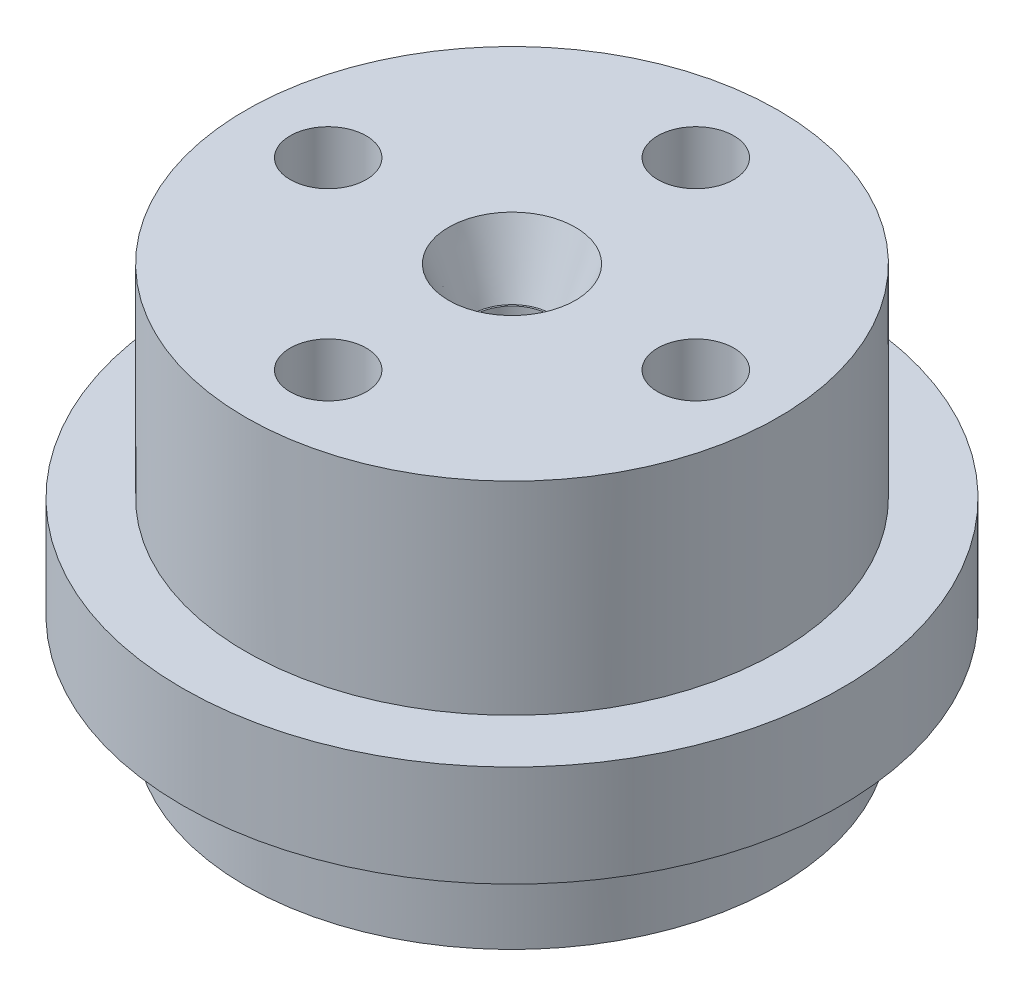
ISO-10303-21;
HEADER;
FILE_DESCRIPTION(('STEP AP214'),'2;1');
FILE_NAME('part.step','',(''),(''),'','','');
FILE_SCHEMA(('AUTOMOTIVE_DESIGN { 1 0 10303 214 1 1 1 1 }'));
ENDSEC;
DATA;
#1=APPLICATION_CONTEXT('core data for automotive mechanical design processes');
#2=APPLICATION_PROTOCOL_DEFINITION('international standard','automotive_design',2000,#1);
#3=PRODUCT_CONTEXT('',#1,'mechanical');
#4=PRODUCT('Part','Part','',(#3));
#5=PRODUCT_RELATED_PRODUCT_CATEGORY('part','',(#4));
#6=PRODUCT_DEFINITION_FORMATION('','',#4);
#7=PRODUCT_DEFINITION_CONTEXT('part definition',#1,'design');
#8=PRODUCT_DEFINITION('design','',#6,#7);
#9=PRODUCT_DEFINITION_SHAPE('','',#8);
#10=(LENGTH_UNIT() NAMED_UNIT(*) SI_UNIT(.MILLI.,.METRE.));
#11=(NAMED_UNIT(*) PLANE_ANGLE_UNIT() SI_UNIT($,.RADIAN.));
#12=(NAMED_UNIT(*) SI_UNIT($,.STERADIAN.) SOLID_ANGLE_UNIT());
#13=UNCERTAINTY_MEASURE_WITH_UNIT(LENGTH_MEASURE(1.E-05),#10,'distance_accuracy_value','');
#14=(GEOMETRIC_REPRESENTATION_CONTEXT(3) GLOBAL_UNCERTAINTY_ASSIGNED_CONTEXT((#13)) GLOBAL_UNIT_ASSIGNED_CONTEXT((#10,
#11,#12)) REPRESENTATION_CONTEXT('',''));
#15=CARTESIAN_POINT('',(0.,0.,0.));
#16=DIRECTION('',(0.,0.,1.));
#17=DIRECTION('',(1.,0.,0.));
#18=AXIS2_PLACEMENT_3D('',#15,#16,#17);
#19=CARTESIAN_POINT('',(0.,16.,0.));
#20=DIRECTION('',(0.,-1.,0.));
#21=DIRECTION('',(0.,0.,-1.));
#22=AXIS2_PLACEMENT_3D('',#19,#20,#21);
#23=CYLINDRICAL_SURFACE('',#22,10.5);
#24=CARTESIAN_POINT('',(0.,16.,0.));
#25=DIRECTION('',(0.,1.,0.));
#26=DIRECTION('',(0.,0.,1.));
#27=AXIS2_PLACEMENT_3D('',#24,#25,#26);
#28=CIRCLE('',#27,10.5);
#29=CARTESIAN_POINT('',(0.,16.,10.5));
#30=VERTEX_POINT('',#29);
#31=EDGE_CURVE('E42',#30,#30,#28,.T.);
#32=ORIENTED_EDGE('',*,*,#31,.F.);
#33=EDGE_LOOP('',(#32));
#34=FACE_BOUND('',#33,.T.);
#35=CARTESIAN_POINT('',(0.,8.,0.));
#36=DIRECTION('',(0.,-1.,0.));
#37=DIRECTION('',(0.,0.,-1.));
#38=AXIS2_PLACEMENT_3D('',#35,#36,#37);
#39=CIRCLE('',#38,10.5);
#40=CARTESIAN_POINT('',(0.,8.,-10.5));
#41=VERTEX_POINT('',#40);
#42=EDGE_CURVE('E10',#41,#41,#39,.T.);
#43=ORIENTED_EDGE('',*,*,#42,.F.);
#44=EDGE_LOOP('',(#43));
#45=FACE_BOUND('',#44,.T.);
#46=ADVANCED_FACE('F35',(#34,#45),#23,.T.);
#47=CARTESIAN_POINT('',(0.,16.,0.));
#48=DIRECTION('',(0.,1.,0.));
#49=DIRECTION('',(0.,0.,1.));
#50=AXIS2_PLACEMENT_3D('',#47,#48,#49);
#51=PLANE('',#50);
#52=CARTESIAN_POINT('',(-7.25000000000016,16.,-3.04711340169281E-13));
#53=DIRECTION('',(0.,1.,0.));
#54=DIRECTION('',(0.,0.,1.));
#55=AXIS2_PLACEMENT_3D('',#52,#53,#54);
#56=CIRCLE('',#55,1.49999999999743);
#57=CARTESIAN_POINT('',(-7.25000000000016,16.,1.49999999999712));
#58=VERTEX_POINT('',#57);
#59=EDGE_CURVE('E137',#58,#58,#56,.T.);
#60=ORIENTED_EDGE('',*,*,#59,.F.);
#61=EDGE_LOOP('',(#60));
#62=FACE_BOUND('',#61,.T.);
#63=CARTESIAN_POINT('',(-1.21608193965515E-13,16.,7.25000000000035));
#64=DIRECTION('',(0.,1.,0.));
#65=DIRECTION('',(0.,0.,1.));
#66=AXIS2_PLACEMENT_3D('',#63,#64,#65);
#67=CIRCLE('',#66,1.49999999999448);
#68=CARTESIAN_POINT('',(-1.21608193965515E-13,16.,8.74999999999483));
#69=VERTEX_POINT('',#68);
#70=EDGE_CURVE('E150',#69,#69,#67,.T.);
#71=ORIENTED_EDGE('',*,*,#70,.F.);
#72=EDGE_LOOP('',(#71));
#73=FACE_BOUND('',#72,.T.);
#74=CARTESIAN_POINT('',(7.25000000000053,16.,3.05599209098663E-13));
#75=DIRECTION('',(0.,1.,0.));
#76=DIRECTION('',(0.,0.,1.));
#77=AXIS2_PLACEMENT_3D('',#74,#75,#76);
#78=CIRCLE('',#77,1.50000000000257);
#79=CARTESIAN_POINT('',(7.25000000000053,16.,1.50000000000288));
#80=VERTEX_POINT('',#79);
#81=EDGE_CURVE('E155',#80,#80,#78,.T.);
#82=ORIENTED_EDGE('',*,*,#81,.F.);
#83=EDGE_LOOP('',(#82));
#84=FACE_BOUND('',#83,.T.);
#85=CARTESIAN_POINT('',(4.89590224231812E-13,16.,-7.25000000000035));
#86=DIRECTION('',(0.,1.,0.));
#87=DIRECTION('',(0.,0.,1.));
#88=AXIS2_PLACEMENT_3D('',#85,#86,#87);
#89=CIRCLE('',#88,1.50000000000552);
#90=CARTESIAN_POINT('',(4.89590224231812E-13,16.,-5.74999999999483));
#91=VERTEX_POINT('',#90);
#92=EDGE_CURVE('E161',#91,#91,#89,.T.);
#93=ORIENTED_EDGE('',*,*,#92,.F.);
#94=EDGE_LOOP('',(#93));
#95=FACE_BOUND('',#94,.T.);
#96=CARTESIAN_POINT('',(0.,16.,0.));
#97=DIRECTION('',(0.,1.,0.));
#98=DIRECTION('',(0.,0.,1.));
#99=AXIS2_PLACEMENT_3D('',#96,#97,#98);
#100=CIRCLE('',#99,2.5);
#101=CARTESIAN_POINT('',(0.,16.,2.5));
#102=VERTEX_POINT('',#101);
#103=EDGE_CURVE('E61',#102,#102,#100,.T.);
#104=ORIENTED_EDGE('',*,*,#103,.F.);
#105=EDGE_LOOP('',(#104));
#106=FACE_BOUND('',#105,.T.);
#107=ORIENTED_EDGE('',*,*,#31,.T.);
#108=EDGE_LOOP('',(#107));
#109=FACE_BOUND('',#108,.T.);
#110=ADVANCED_FACE('F89',(#62,#73,#84,#95,#106,#109),#51,.T.);
#111=CARTESIAN_POINT('',(0.,13.5,0.));
#112=DIRECTION('',(0.,1.,0.));
#113=DIRECTION('',(0.,0.,1.));
#114=AXIS2_PLACEMENT_3D('',#111,#112,#113);
#115=PLANE('',#114);
#116=CARTESIAN_POINT('',(0.,13.5,0.));
#117=DIRECTION('',(0.,1.,0.));
#118=DIRECTION('',(0.,0.,1.));
#119=AXIS2_PLACEMENT_3D('',#116,#117,#118);
#120=CIRCLE('',#119,1.56528830128799);
#121=CARTESIAN_POINT('',(0.,13.5,1.56528830128799));
#122=VERTEX_POINT('',#121);
#123=EDGE_CURVE('E58',#122,#122,#120,.T.);
#124=ORIENTED_EDGE('',*,*,#123,.T.);
#125=EDGE_LOOP('',(#124));
#126=FACE_BOUND('',#125,.T.);
#127=CARTESIAN_POINT('',(0.,13.5,0.));
#128=DIRECTION('',(0.,1.,0.));
#129=DIRECTION('',(0.,0.,1.));
#130=AXIS2_PLACEMENT_3D('',#127,#128,#129);
#131=CIRCLE('',#130,1.5);
#132=CARTESIAN_POINT('',(0.,13.5,1.5));
#133=VERTEX_POINT('',#132);
#134=EDGE_CURVE('E56',#133,#133,#131,.F.);
#135=ORIENTED_EDGE('',*,*,#134,.T.);
#136=EDGE_LOOP('',(#135));
#137=FACE_BOUND('',#136,.T.);
#138=ADVANCED_FACE('F79',(#126,#137),#115,.T.);
#139=CARTESIAN_POINT('',(0.,16.,0.));
#140=DIRECTION('',(0.,1.,0.));
#141=DIRECTION('',(0.,0.,1.));
#142=AXIS2_PLACEMENT_3D('',#139,#140,#141);
#143=CONICAL_SURFACE('',#142,2.5,0.357792496658838);
#144=ORIENTED_EDGE('',*,*,#123,.F.);
#145=EDGE_LOOP('',(#144));
#146=FACE_BOUND('',#145,.T.);
#147=ORIENTED_EDGE('',*,*,#103,.T.);
#148=EDGE_LOOP('',(#147));
#149=FACE_BOUND('',#148,.T.);
#150=ADVANCED_FACE('F82',(#146,#149),#143,.F.);
#151=CARTESIAN_POINT('',(0.,8.,0.));
#152=DIRECTION('',(0.,-1.,0.));
#153=DIRECTION('',(0.,0.,-1.));
#154=AXIS2_PLACEMENT_3D('',#151,#152,#153);
#155=CYLINDRICAL_SURFACE('',#154,13.);
#156=CARTESIAN_POINT('',(0.,8.,0.));
#157=DIRECTION('',(0.,-1.,0.));
#158=DIRECTION('',(0.,0.,-1.));
#159=AXIS2_PLACEMENT_3D('',#156,#157,#158);
#160=CIRCLE('',#159,13.);
#161=CARTESIAN_POINT('',(0.,8.,-13.));
#162=VERTEX_POINT('',#161);
#163=EDGE_CURVE('E62',#162,#162,#160,.T.);
#164=ORIENTED_EDGE('',*,*,#163,.T.);
#165=EDGE_LOOP('',(#164));
#166=FACE_BOUND('',#165,.T.);
#167=CARTESIAN_POINT('',(0.,4.,0.));
#168=DIRECTION('',(0.,-1.,0.));
#169=DIRECTION('',(0.,0.,-1.));
#170=AXIS2_PLACEMENT_3D('',#167,#168,#169);
#171=CIRCLE('',#170,13.);
#172=CARTESIAN_POINT('',(0.,4.,-13.));
#173=VERTEX_POINT('',#172);
#174=EDGE_CURVE('E68',#173,#173,#171,.T.);
#175=ORIENTED_EDGE('',*,*,#174,.F.);
#176=EDGE_LOOP('',(#175));
#177=FACE_BOUND('',#176,.T.);
#178=ADVANCED_FACE('F85',(#166,#177),#155,.T.);
#179=CARTESIAN_POINT('',(0.,4.,0.));
#180=DIRECTION('',(0.,-1.,0.));
#181=DIRECTION('',(0.,0.,-1.));
#182=AXIS2_PLACEMENT_3D('',#179,#180,#181);
#183=PLANE('',#182);
#184=ORIENTED_EDGE('',*,*,#174,.T.);
#185=EDGE_LOOP('',(#184));
#186=FACE_BOUND('',#185,.T.);
#187=CARTESIAN_POINT('',(0.,4.,0.));
#188=DIRECTION('',(0.,-1.,0.));
#189=DIRECTION('',(0.,0.,-1.));
#190=AXIS2_PLACEMENT_3D('',#187,#188,#189);
#191=CIRCLE('',#190,10.5);
#192=CARTESIAN_POINT('',(0.,4.,-10.5));
#193=VERTEX_POINT('',#192);
#194=EDGE_CURVE('E59',#193,#193,#191,.T.);
#195=ORIENTED_EDGE('',*,*,#194,.F.);
#196=EDGE_LOOP('',(#195));
#197=FACE_BOUND('',#196,.T.);
#198=ADVANCED_FACE('F182',(#186,#197),#183,.T.);
#199=CARTESIAN_POINT('',(0.,8.,0.));
#200=DIRECTION('',(0.,-1.,0.));
#201=DIRECTION('',(0.,0.,-1.));
#202=AXIS2_PLACEMENT_3D('',#199,#200,#201);
#203=PLANE('',#202);
#204=ORIENTED_EDGE('',*,*,#163,.F.);
#205=EDGE_LOOP('',(#204));
#206=FACE_BOUND('',#205,.T.);
#207=ORIENTED_EDGE('',*,*,#42,.T.);
#208=EDGE_LOOP('',(#207));
#209=FACE_BOUND('',#208,.T.);
#210=ADVANCED_FACE('F111',(#206,#209),#203,.F.);
#211=CARTESIAN_POINT('',(0.,0.,0.));
#212=DIRECTION('',(0.,1.,0.));
#213=DIRECTION('',(0.,0.,1.));
#214=AXIS2_PLACEMENT_3D('',#211,#212,#213);
#215=CYLINDRICAL_SURFACE('',#214,1.5);
#216=CARTESIAN_POINT('',(0.,0.,0.));
#217=DIRECTION('',(0.,1.,0.));
#218=DIRECTION('',(0.,0.,1.));
#219=AXIS2_PLACEMENT_3D('',#216,#217,#218);
#220=CIRCLE('',#219,1.5);
#221=CARTESIAN_POINT('',(0.,0.,1.5));
#222=VERTEX_POINT('',#221);
#223=EDGE_CURVE('E51',#222,#222,#220,.T.);
#224=ORIENTED_EDGE('',*,*,#223,.F.);
#225=EDGE_LOOP('',(#224));
#226=FACE_BOUND('',#225,.T.);
#227=ORIENTED_EDGE('',*,*,#134,.F.);
#228=EDGE_LOOP('',(#227));
#229=FACE_BOUND('',#228,.T.);
#230=ADVANCED_FACE('F102',(#226,#229),#215,.F.);
#231=CARTESIAN_POINT('',(0.,0.,0.));
#232=DIRECTION('',(0.,1.,0.));
#233=DIRECTION('',(0.,0.,1.));
#234=AXIS2_PLACEMENT_3D('',#231,#232,#233);
#235=PLANE('',#234);
#236=CARTESIAN_POINT('',(0.,0.,7.24999999999996));
#237=DIRECTION('',(0.,1.,0.));
#238=DIRECTION('',(0.,0.,1.));
#239=AXIS2_PLACEMENT_3D('',#236,#237,#238);
#240=CIRCLE('',#239,0.999999999997313);
#241=CARTESIAN_POINT('',(0.,0.,8.24999999999727));
#242=VERTEX_POINT('',#241);
#243=EDGE_CURVE('E116',#242,#242,#240,.T.);
#244=ORIENTED_EDGE('',*,*,#243,.T.);
#245=EDGE_LOOP('',(#244));
#246=FACE_BOUND('',#245,.T.);
#247=CARTESIAN_POINT('',(7.25000000000016,0.,-1.10478750476657E-13));
#248=DIRECTION('',(0.,1.,0.));
#249=DIRECTION('',(0.,0.,1.));
#250=AXIS2_PLACEMENT_3D('',#247,#248,#249);
#251=CIRCLE('',#250,0.999999999997564);
#252=CARTESIAN_POINT('',(7.25000000000016,0.,0.999999999997454));
#253=VERTEX_POINT('',#252);
#254=EDGE_CURVE('E120',#253,#253,#251,.T.);
#255=ORIENTED_EDGE('',*,*,#254,.T.);
#256=EDGE_LOOP('',(#255));
#257=FACE_BOUND('',#256,.T.);
#258=CARTESIAN_POINT('',(0.,0.,-7.25000000000037));
#259=DIRECTION('',(0.,1.,0.));
#260=DIRECTION('',(0.,0.,1.));
#261=AXIS2_PLACEMENT_3D('',#258,#259,#260);
#262=CIRCLE('',#261,0.999999999997694);
#263=CARTESIAN_POINT('',(0.,0.,-6.25000000000268));
#264=VERTEX_POINT('',#263);
#265=EDGE_CURVE('E124',#264,#264,#262,.T.);
#266=ORIENTED_EDGE('',*,*,#265,.T.);
#267=EDGE_LOOP('',(#266));
#268=FACE_BOUND('',#267,.T.);
#269=CARTESIAN_POINT('',(-7.25000000000016,0.,-3.04711340169281E-13));
#270=DIRECTION('',(0.,1.,0.));
#271=DIRECTION('',(0.,0.,1.));
#272=AXIS2_PLACEMENT_3D('',#269,#270,#271);
#273=CIRCLE('',#272,0.999999999997428);
#274=CARTESIAN_POINT('',(-7.25000000000016,0.,0.999999999997124));
#275=VERTEX_POINT('',#274);
#276=EDGE_CURVE('E128',#275,#275,#273,.T.);
#277=ORIENTED_EDGE('',*,*,#276,.T.);
#278=EDGE_LOOP('',(#277));
#279=FACE_BOUND('',#278,.T.);
#280=ORIENTED_EDGE('',*,*,#223,.T.);
#281=EDGE_LOOP('',(#280));
#282=FACE_BOUND('',#281,.T.);
#283=CARTESIAN_POINT('',(0.,0.,0.));
#284=DIRECTION('',(0.,1.,0.));
#285=DIRECTION('',(0.,0.,1.));
#286=AXIS2_PLACEMENT_3D('',#283,#284,#285);
#287=CIRCLE('',#286,10.5);
#288=CARTESIAN_POINT('',(0.,0.,10.5));
#289=VERTEX_POINT('',#288);
#290=EDGE_CURVE('E46',#289,#289,#287,.T.);
#291=ORIENTED_EDGE('',*,*,#290,.F.);
#292=EDGE_LOOP('',(#291));
#293=FACE_BOUND('',#292,.T.);
#294=ADVANCED_FACE('F103',(#246,#257,#268,#279,#282,#293),#235,.F.);
#295=ORIENTED_EDGE('',*,*,#194,.T.);
#296=EDGE_LOOP('',(#295));
#297=FACE_BOUND('',#296,.T.);
#298=ORIENTED_EDGE('',*,*,#290,.T.);
#299=EDGE_LOOP('',(#298));
#300=FACE_BOUND('',#299,.T.);
#301=ADVANCED_FACE('F37',(#297,#300),#23,.T.);
#302=CARTESIAN_POINT('',(4.89590224231812E-13,6.,-7.25000000000035));
#303=DIRECTION('',(0.,1.,0.));
#304=DIRECTION('',(0.,0.,1.));
#305=AXIS2_PLACEMENT_3D('',#302,#303,#304);
#306=CYLINDRICAL_SURFACE('',#305,1.50000000000552);
#307=CARTESIAN_POINT('',(4.89590224231812E-13,6.,-7.25000000000035));
#308=DIRECTION('',(0.,1.,0.));
#309=DIRECTION('',(0.,0.,1.));
#310=AXIS2_PLACEMENT_3D('',#307,#308,#309);
#311=CIRCLE('',#310,1.50000000000552);
#312=CARTESIAN_POINT('',(4.89590224231812E-13,6.,-5.74999999999483));
#313=VERTEX_POINT('',#312);
#314=EDGE_CURVE('E73',#313,#313,#311,.T.);
#315=ORIENTED_EDGE('',*,*,#314,.F.);
#316=EDGE_LOOP('',(#315));
#317=FACE_BOUND('',#316,.T.);
#318=ORIENTED_EDGE('',*,*,#92,.T.);
#319=EDGE_LOOP('',(#318));
#320=FACE_BOUND('',#319,.T.);
#321=ADVANCED_FACE('F110',(#317,#320),#306,.F.);
#322=CARTESIAN_POINT('',(4.89590224231812E-13,6.,-7.25000000000035));
#323=DIRECTION('',(0.,1.,0.));
#324=DIRECTION('',(0.,0.,1.));
#325=AXIS2_PLACEMENT_3D('',#322,#323,#324);
#326=PLANE('',#325);
#327=CARTESIAN_POINT('',(0.,6.,-7.25000000000037));
#328=DIRECTION('',(0.,1.,0.));
#329=DIRECTION('',(0.,0.,1.));
#330=AXIS2_PLACEMENT_3D('',#327,#328,#329);
#331=CIRCLE('',#330,0.999999999997694);
#332=CARTESIAN_POINT('',(0.,6.,-6.25000000000268));
#333=VERTEX_POINT('',#332);
#334=EDGE_CURVE('E146',#333,#333,#331,.T.);
#335=ORIENTED_EDGE('',*,*,#334,.F.);
#336=EDGE_LOOP('',(#335));
#337=FACE_BOUND('',#336,.T.);
#338=ORIENTED_EDGE('',*,*,#314,.T.);
#339=EDGE_LOOP('',(#338));
#340=FACE_BOUND('',#339,.T.);
#341=ADVANCED_FACE('F170',(#337,#340),#326,.T.);
#342=CARTESIAN_POINT('',(7.25000000000053,6.,3.05599209098663E-13));
#343=DIRECTION('',(0.,1.,0.));
#344=DIRECTION('',(0.,0.,1.));
#345=AXIS2_PLACEMENT_3D('',#342,#343,#344);
#346=CYLINDRICAL_SURFACE('',#345,1.50000000000257);
#347=CARTESIAN_POINT('',(7.25000000000053,6.,3.05599209098663E-13));
#348=DIRECTION('',(0.,1.,0.));
#349=DIRECTION('',(0.,0.,1.));
#350=AXIS2_PLACEMENT_3D('',#347,#348,#349);
#351=CIRCLE('',#350,1.50000000000257);
#352=CARTESIAN_POINT('',(7.25000000000053,6.,1.50000000000288));
#353=VERTEX_POINT('',#352);
#354=EDGE_CURVE('E158',#353,#353,#351,.T.);
#355=ORIENTED_EDGE('',*,*,#354,.F.);
#356=EDGE_LOOP('',(#355));
#357=FACE_BOUND('',#356,.T.);
#358=ORIENTED_EDGE('',*,*,#81,.T.);
#359=EDGE_LOOP('',(#358));
#360=FACE_BOUND('',#359,.T.);
#361=ADVANCED_FACE('F176',(#357,#360),#346,.F.);
#362=CARTESIAN_POINT('',(7.25000000000053,6.,3.05599209098663E-13));
#363=DIRECTION('',(0.,1.,0.));
#364=DIRECTION('',(0.,0.,1.));
#365=AXIS2_PLACEMENT_3D('',#362,#363,#364);
#366=PLANE('',#365);
#367=CARTESIAN_POINT('',(7.25000000000016,6.,-1.10478750476657E-13));
#368=DIRECTION('',(0.,1.,0.));
#369=DIRECTION('',(0.,0.,1.));
#370=AXIS2_PLACEMENT_3D('',#367,#368,#369);
#371=CIRCLE('',#370,0.999999999997564);
#372=CARTESIAN_POINT('',(7.25000000000016,6.,0.999999999997454));
#373=VERTEX_POINT('',#372);
#374=EDGE_CURVE('E385',#373,#373,#371,.T.);
#375=ORIENTED_EDGE('',*,*,#374,.F.);
#376=EDGE_LOOP('',(#375));
#377=FACE_BOUND('',#376,.T.);
#378=ORIENTED_EDGE('',*,*,#354,.T.);
#379=EDGE_LOOP('',(#378));
#380=FACE_BOUND('',#379,.T.);
#381=ADVANCED_FACE('F287',(#377,#380),#366,.T.);
#382=CARTESIAN_POINT('',(-1.21608193965515E-13,6.,7.25000000000035));
#383=DIRECTION('',(0.,1.,0.));
#384=DIRECTION('',(0.,0.,1.));
#385=AXIS2_PLACEMENT_3D('',#382,#383,#384);
#386=CYLINDRICAL_SURFACE('',#385,1.49999999999448);
#387=CARTESIAN_POINT('',(-1.21608193965515E-13,6.,7.25000000000035));
#388=DIRECTION('',(0.,1.,0.));
#389=DIRECTION('',(0.,0.,1.));
#390=AXIS2_PLACEMENT_3D('',#387,#388,#389);
#391=CIRCLE('',#390,1.49999999999448);
#392=CARTESIAN_POINT('',(-1.21608193965515E-13,6.,8.74999999999483));
#393=VERTEX_POINT('',#392);
#394=EDGE_CURVE('E152',#393,#393,#391,.T.);
#395=ORIENTED_EDGE('',*,*,#394,.F.);
#396=EDGE_LOOP('',(#395));
#397=FACE_BOUND('',#396,.T.);
#398=ORIENTED_EDGE('',*,*,#70,.T.);
#399=EDGE_LOOP('',(#398));
#400=FACE_BOUND('',#399,.T.);
#401=ADVANCED_FACE('F279',(#397,#400),#386,.F.);
#402=CARTESIAN_POINT('',(-1.21608193965515E-13,6.,7.25000000000035));
#403=DIRECTION('',(0.,1.,0.));
#404=DIRECTION('',(0.,0.,1.));
#405=AXIS2_PLACEMENT_3D('',#402,#403,#404);
#406=PLANE('',#405);
#407=CARTESIAN_POINT('',(0.,6.,7.24999999999996));
#408=DIRECTION('',(0.,1.,0.));
#409=DIRECTION('',(0.,0.,1.));
#410=AXIS2_PLACEMENT_3D('',#407,#408,#409);
#411=CIRCLE('',#410,0.999999999997313);
#412=CARTESIAN_POINT('',(0.,6.,8.24999999999727));
#413=VERTEX_POINT('',#412);
#414=EDGE_CURVE('E389',#413,#413,#411,.T.);
#415=ORIENTED_EDGE('',*,*,#414,.F.);
#416=EDGE_LOOP('',(#415));
#417=FACE_BOUND('',#416,.T.);
#418=ORIENTED_EDGE('',*,*,#394,.T.);
#419=EDGE_LOOP('',(#418));
#420=FACE_BOUND('',#419,.T.);
#421=ADVANCED_FACE('F274',(#417,#420),#406,.T.);
#422=CARTESIAN_POINT('',(-7.25000000000016,6.,-3.04711340169281E-13));
#423=DIRECTION('',(0.,1.,0.));
#424=DIRECTION('',(0.,0.,1.));
#425=AXIS2_PLACEMENT_3D('',#422,#423,#424);
#426=CYLINDRICAL_SURFACE('',#425,1.49999999999743);
#427=CARTESIAN_POINT('',(-7.25000000000016,6.,-3.04711340169281E-13));
#428=DIRECTION('',(0.,1.,0.));
#429=DIRECTION('',(0.,0.,1.));
#430=AXIS2_PLACEMENT_3D('',#427,#428,#429);
#431=CIRCLE('',#430,1.49999999999743);
#432=CARTESIAN_POINT('',(-7.25000000000016,6.,1.49999999999712));
#433=VERTEX_POINT('',#432);
#434=EDGE_CURVE('E141',#433,#433,#431,.T.);
#435=ORIENTED_EDGE('',*,*,#434,.F.);
#436=EDGE_LOOP('',(#435));
#437=FACE_BOUND('',#436,.T.);
#438=ORIENTED_EDGE('',*,*,#59,.T.);
#439=EDGE_LOOP('',(#438));
#440=FACE_BOUND('',#439,.T.);
#441=ADVANCED_FACE('F266',(#437,#440),#426,.F.);
#442=CARTESIAN_POINT('',(-7.25000000000016,6.,-3.04711340169281E-13));
#443=DIRECTION('',(0.,1.,0.));
#444=DIRECTION('',(0.,0.,1.));
#445=AXIS2_PLACEMENT_3D('',#442,#443,#444);
#446=PLANE('',#445);
#447=CARTESIAN_POINT('',(-7.25000000000016,6.,-3.04711340169281E-13));
#448=DIRECTION('',(0.,1.,0.));
#449=DIRECTION('',(0.,0.,1.));
#450=AXIS2_PLACEMENT_3D('',#447,#448,#449);
#451=CIRCLE('',#450,0.999999999997428);
#452=CARTESIAN_POINT('',(-7.25000000000016,6.,0.999999999997124));
#453=VERTEX_POINT('',#452);
#454=EDGE_CURVE('E138',#453,#453,#451,.T.);
#455=ORIENTED_EDGE('',*,*,#454,.F.);
#456=EDGE_LOOP('',(#455));
#457=FACE_BOUND('',#456,.T.);
#458=ORIENTED_EDGE('',*,*,#434,.T.);
#459=EDGE_LOOP('',(#458));
#460=FACE_BOUND('',#459,.T.);
#461=ADVANCED_FACE('F256',(#457,#460),#446,.T.);
#462=CARTESIAN_POINT('',(-7.25000000000016,0.,-3.04711340169281E-13));
#463=DIRECTION('',(0.,1.,0.));
#464=DIRECTION('',(0.,0.,1.));
#465=AXIS2_PLACEMENT_3D('',#462,#463,#464);
#466=CYLINDRICAL_SURFACE('',#465,0.999999999997428);
#467=ORIENTED_EDGE('',*,*,#276,.F.);
#468=EDGE_LOOP('',(#467));
#469=FACE_BOUND('',#468,.T.);
#470=ORIENTED_EDGE('',*,*,#454,.T.);
#471=EDGE_LOOP('',(#470));
#472=FACE_BOUND('',#471,.T.);
#473=ADVANCED_FACE('F246',(#469,#472),#466,.F.);
#474=CARTESIAN_POINT('',(0.,0.,-7.25000000000037));
#475=DIRECTION('',(0.,1.,0.));
#476=DIRECTION('',(0.,0.,1.));
#477=AXIS2_PLACEMENT_3D('',#474,#475,#476);
#478=CYLINDRICAL_SURFACE('',#477,0.999999999997694);
#479=ORIENTED_EDGE('',*,*,#265,.F.);
#480=EDGE_LOOP('',(#479));
#481=FACE_BOUND('',#480,.T.);
#482=ORIENTED_EDGE('',*,*,#334,.T.);
#483=EDGE_LOOP('',(#482));
#484=FACE_BOUND('',#483,.T.);
#485=ADVANCED_FACE('F235',(#481,#484),#478,.F.);
#486=CARTESIAN_POINT('',(7.25000000000016,0.,-1.10478750476657E-13));
#487=DIRECTION('',(0.,1.,0.));
#488=DIRECTION('',(0.,0.,1.));
#489=AXIS2_PLACEMENT_3D('',#486,#487,#488);
#490=CYLINDRICAL_SURFACE('',#489,0.999999999997564);
#491=ORIENTED_EDGE('',*,*,#254,.F.);
#492=EDGE_LOOP('',(#491));
#493=FACE_BOUND('',#492,.T.);
#494=ORIENTED_EDGE('',*,*,#374,.T.);
#495=EDGE_LOOP('',(#494));
#496=FACE_BOUND('',#495,.T.);
#497=ADVANCED_FACE('F223',(#493,#496),#490,.F.);
#498=CARTESIAN_POINT('',(0.,0.,7.24999999999996));
#499=DIRECTION('',(0.,1.,0.));
#500=DIRECTION('',(0.,0.,1.));
#501=AXIS2_PLACEMENT_3D('',#498,#499,#500);
#502=CYLINDRICAL_SURFACE('',#501,0.999999999997313);
#503=ORIENTED_EDGE('',*,*,#243,.F.);
#504=EDGE_LOOP('',(#503));
#505=FACE_BOUND('',#504,.T.);
#506=ORIENTED_EDGE('',*,*,#414,.T.);
#507=EDGE_LOOP('',(#506));
#508=FACE_BOUND('',#507,.T.);
#509=ADVANCED_FACE('F218',(#505,#508),#502,.F.);
#510=CLOSED_SHELL('',(#46,#110,#138,#150,#178,#198,#210,#230,#294,#301,#321,#341,#361,#381,#401,
#421,#441,#461,#473,#485,#497,#509));
#511=MANIFOLD_SOLID_BREP('B2',#510);
#512=ADVANCED_BREP_SHAPE_REPRESENTATION('',(#18,#511),#14);
#513=SHAPE_DEFINITION_REPRESENTATION(#9,#512);
ENDSEC;
END-ISO-10303-21;
